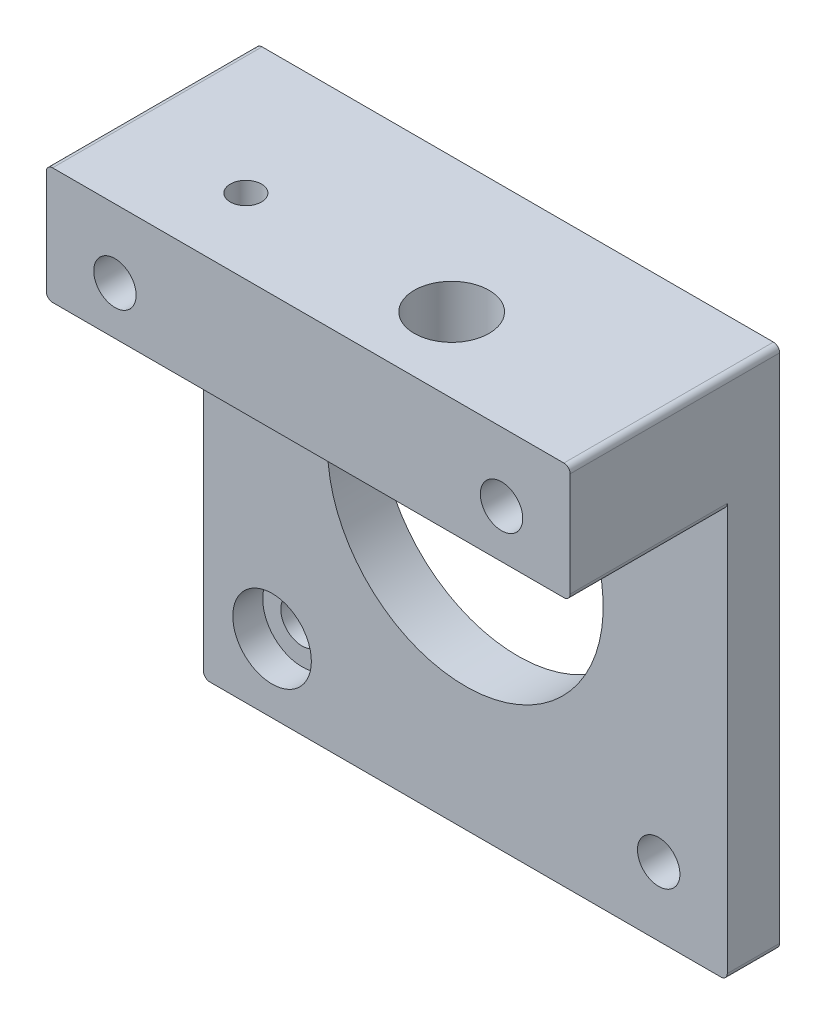
ISO-10303-21;
HEADER;
FILE_DESCRIPTION(('STEP AP214'),'2;1');
FILE_NAME('part.step','',(''),(''),'','','');
FILE_SCHEMA(('AUTOMOTIVE_DESIGN { 1 0 10303 214 1 1 1 1 }'));
ENDSEC;
DATA;
#1=APPLICATION_CONTEXT('core data for automotive mechanical design processes');
#2=APPLICATION_PROTOCOL_DEFINITION('international standard','automotive_design',2000,#1);
#3=PRODUCT_CONTEXT('',#1,'mechanical');
#4=PRODUCT('Part','Part','',(#3));
#5=PRODUCT_RELATED_PRODUCT_CATEGORY('part','',(#4));
#6=PRODUCT_DEFINITION_FORMATION('','',#4);
#7=PRODUCT_DEFINITION_CONTEXT('part definition',#1,'design');
#8=PRODUCT_DEFINITION('design','',#6,#7);
#9=PRODUCT_DEFINITION_SHAPE('','',#8);
#10=(LENGTH_UNIT() NAMED_UNIT(*) SI_UNIT(.MILLI.,.METRE.));
#11=(NAMED_UNIT(*) PLANE_ANGLE_UNIT() SI_UNIT($,.RADIAN.));
#12=(NAMED_UNIT(*) SI_UNIT($,.STERADIAN.) SOLID_ANGLE_UNIT());
#13=UNCERTAINTY_MEASURE_WITH_UNIT(LENGTH_MEASURE(1.E-05),#10,'distance_accuracy_value','');
#14=(GEOMETRIC_REPRESENTATION_CONTEXT(3) GLOBAL_UNCERTAINTY_ASSIGNED_CONTEXT((#13)) GLOBAL_UNIT_ASSIGNED_CONTEXT((#10,
#11,#12)) REPRESENTATION_CONTEXT('',''));
#15=CARTESIAN_POINT('',(0.,0.,0.));
#16=DIRECTION('',(0.,0.,1.));
#17=DIRECTION('',(1.,0.,0.));
#18=AXIS2_PLACEMENT_3D('',#15,#16,#17);
#19=CARTESIAN_POINT('',(-15.5,-15.5,16.8));
#20=DIRECTION('',(0.,0.,1.));
#21=DIRECTION('',(1.,0.,0.));
#22=AXIS2_PLACEMENT_3D('',#19,#20,#21);
#23=CYLINDRICAL_SURFACE('',#22,1.7);
#24=CARTESIAN_POINT('',(-15.5,-15.5,0.));
#25=DIRECTION('',(0.,0.,1.));
#26=DIRECTION('',(1.,0.,0.));
#27=AXIS2_PLACEMENT_3D('',#24,#25,#26);
#28=CIRCLE('',#27,1.7);
#29=CARTESIAN_POINT('',(-13.8,-15.5,0.));
#30=VERTEX_POINT('',#29);
#31=EDGE_CURVE('E328',#30,#30,#28,.T.);
#32=ORIENTED_EDGE('',*,*,#31,.F.);
#33=EDGE_LOOP('',(#32));
#34=FACE_BOUND('',#33,.T.);
#35=CARTESIAN_POINT('',(-15.5,-15.5,1.8));
#36=DIRECTION('',(0.,0.,1.));
#37=DIRECTION('',(1.,0.,0.));
#38=AXIS2_PLACEMENT_3D('',#35,#36,#37);
#39=CIRCLE('',#38,1.7);
#40=CARTESIAN_POINT('',(-13.8,-15.5,1.8));
#41=VERTEX_POINT('',#40);
#42=EDGE_CURVE('E300',#41,#41,#39,.F.);
#43=ORIENTED_EDGE('',*,*,#42,.F.);
#44=EDGE_LOOP('',(#43));
#45=FACE_BOUND('',#44,.T.);
#46=ADVANCED_FACE('F37',(#34,#45),#23,.F.);
#47=CARTESIAN_POINT('',(21.,21.,16.8));
#48=DIRECTION('',(-1.,0.,0.));
#49=DIRECTION('',(0.,-1.,0.));
#50=AXIS2_PLACEMENT_3D('',#47,#48,#49);
#51=PLANE('',#50);
#52=DIRECTION('',(0.,1.,0.));
#53=VECTOR('',#52,1.);
#54=CARTESIAN_POINT('',(21.,-21.,4.2));
#55=LINE('',#54,#53);
#56=CARTESIAN_POINT('',(21.,-20.5,4.2));
#57=VERTEX_POINT('',#56);
#58=CARTESIAN_POINT('',(21.,12.15,4.2));
#59=VERTEX_POINT('',#58);
#60=EDGE_CURVE('E150',#57,#59,#55,.T.);
#61=ORIENTED_EDGE('',*,*,#60,.F.);
#62=DIRECTION('',(0.,0.,-1.));
#63=VECTOR('',#62,1.);
#64=CARTESIAN_POINT('',(21.,-20.5,16.8));
#65=LINE('',#64,#63);
#66=CARTESIAN_POINT('',(21.,-20.5,0.));
#67=VERTEX_POINT('',#66);
#68=EDGE_CURVE('E179',#57,#67,#65,.T.);
#69=ORIENTED_EDGE('',*,*,#68,.T.);
#70=DIRECTION('',(0.,1.,0.));
#71=VECTOR('',#70,1.);
#72=CARTESIAN_POINT('',(21.,21.,0.));
#73=LINE('',#72,#71);
#74=CARTESIAN_POINT('',(21.,20.5,0.));
#75=VERTEX_POINT('',#74);
#76=EDGE_CURVE('E206',#67,#75,#73,.T.);
#77=ORIENTED_EDGE('',*,*,#76,.T.);
#78=DIRECTION('',(0.,0.,-1.));
#79=VECTOR('',#78,1.);
#80=CARTESIAN_POINT('',(21.,20.5,16.8));
#81=LINE('',#80,#79);
#82=CARTESIAN_POINT('',(21.,20.5,16.8));
#83=VERTEX_POINT('',#82);
#84=EDGE_CURVE('E177',#75,#83,#81,.F.);
#85=ORIENTED_EDGE('',*,*,#84,.T.);
#86=DIRECTION('',(0.,1.,0.));
#87=VECTOR('',#86,1.);
#88=CARTESIAN_POINT('',(21.,21.,16.8));
#89=LINE('',#88,#87);
#90=CARTESIAN_POINT('',(21.,12.15,16.8));
#91=VERTEX_POINT('',#90);
#92=EDGE_CURVE('E285',#91,#83,#89,.T.);
#93=ORIENTED_EDGE('',*,*,#92,.F.);
#94=DIRECTION('',(0.,0.,1.));
#95=VECTOR('',#94,1.);
#96=CARTESIAN_POINT('',(21.,12.15,16.8));
#97=LINE('',#96,#95);
#98=EDGE_CURVE('E139',#91,#59,#97,.F.);
#99=ORIENTED_EDGE('',*,*,#98,.T.);
#100=EDGE_LOOP('',(#61,#69,#77,#85,#93,#99));
#101=FACE_BOUND('',#100,.T.);
#102=ADVANCED_FACE('F222',(#101),#51,.F.);
#103=CARTESIAN_POINT('',(-21.,21.,16.8));
#104=DIRECTION('',(0.,-1.,0.));
#105=DIRECTION('',(0.,0.,-1.));
#106=AXIS2_PLACEMENT_3D('',#103,#104,#105);
#107=PLANE('',#106);
#108=CARTESIAN_POINT('',(5.49999999999998,21.,10.8));
#109=DIRECTION('',(0.,1.,0.));
#110=DIRECTION('',(0.,0.,1.));
#111=AXIS2_PLACEMENT_3D('',#108,#109,#110);
#112=CIRCLE('',#111,3.);
#113=CARTESIAN_POINT('',(5.49999999999998,21.,13.8));
#114=VERTEX_POINT('',#113);
#115=EDGE_CURVE('E540',#114,#114,#112,.T.);
#116=ORIENTED_EDGE('',*,*,#115,.F.);
#117=EDGE_LOOP('',(#116));
#118=FACE_BOUND('',#117,.T.);
#119=CARTESIAN_POINT('',(-11.,21.,10.8));
#120=DIRECTION('',(0.,1.,0.));
#121=DIRECTION('',(0.,0.,1.));
#122=AXIS2_PLACEMENT_3D('',#119,#120,#121);
#123=CIRCLE('',#122,1.25);
#124=CARTESIAN_POINT('',(-11.,21.,12.05));
#125=VERTEX_POINT('',#124);
#126=EDGE_CURVE('E537',#125,#125,#123,.T.);
#127=ORIENTED_EDGE('',*,*,#126,.F.);
#128=EDGE_LOOP('',(#127));
#129=FACE_BOUND('',#128,.T.);
#130=DIRECTION('',(-1.,0.,0.));
#131=VECTOR('',#130,1.);
#132=CARTESIAN_POINT('',(-21.,21.,16.8));
#133=LINE('',#132,#131);
#134=CARTESIAN_POINT('',(20.5,21.,16.8));
#135=VERTEX_POINT('',#134);
#136=CARTESIAN_POINT('',(-20.5,21.,16.8));
#137=VERTEX_POINT('',#136);
#138=EDGE_CURVE('E288',#135,#137,#133,.T.);
#139=ORIENTED_EDGE('',*,*,#138,.F.);
#140=DIRECTION('',(0.,0.,-1.));
#141=VECTOR('',#140,1.);
#142=CARTESIAN_POINT('',(20.5,21.,16.8));
#143=LINE('',#142,#141);
#144=CARTESIAN_POINT('',(20.5,21.,0.));
#145=VERTEX_POINT('',#144);
#146=EDGE_CURVE('E184',#135,#145,#143,.T.);
#147=ORIENTED_EDGE('',*,*,#146,.T.);
#148=DIRECTION('',(-1.,0.,0.));
#149=VECTOR('',#148,1.);
#150=CARTESIAN_POINT('',(-21.,21.,0.));
#151=LINE('',#150,#149);
#152=CARTESIAN_POINT('',(-20.5,21.,0.));
#153=VERTEX_POINT('',#152);
#154=EDGE_CURVE('E294',#145,#153,#151,.T.);
#155=ORIENTED_EDGE('',*,*,#154,.T.);
#156=DIRECTION('',(0.,0.,-1.));
#157=VECTOR('',#156,1.);
#158=CARTESIAN_POINT('',(-20.5,21.,16.8));
#159=LINE('',#158,#157);
#160=EDGE_CURVE('E182',#153,#137,#159,.F.);
#161=ORIENTED_EDGE('',*,*,#160,.T.);
#162=EDGE_LOOP('',(#139,#147,#155,#161));
#163=FACE_BOUND('',#162,.T.);
#164=ADVANCED_FACE('F228',(#118,#129,#163),#107,.F.);
#165=CARTESIAN_POINT('',(-21.,21.,16.8));
#166=DIRECTION('',(1.,0.,0.));
#167=DIRECTION('',(0.,0.,-1.));
#168=AXIS2_PLACEMENT_3D('',#165,#166,#167);
#169=PLANE('',#168);
#170=DIRECTION('',(0.,-1.,0.));
#171=VECTOR('',#170,1.);
#172=CARTESIAN_POINT('',(-21.,21.,0.));
#173=LINE('',#172,#171);
#174=CARTESIAN_POINT('',(-21.,20.5,0.));
#175=VERTEX_POINT('',#174);
#176=CARTESIAN_POINT('',(-21.,-20.5,0.));
#177=VERTEX_POINT('',#176);
#178=EDGE_CURVE('E297',#175,#177,#173,.T.);
#179=ORIENTED_EDGE('',*,*,#178,.T.);
#180=DIRECTION('',(0.,0.,-1.));
#181=VECTOR('',#180,1.);
#182=CARTESIAN_POINT('',(-21.,-20.5,16.8));
#183=LINE('',#182,#181);
#184=CARTESIAN_POINT('',(-21.,-20.5,4.2));
#185=VERTEX_POINT('',#184);
#186=EDGE_CURVE('E172',#177,#185,#183,.F.);
#187=ORIENTED_EDGE('',*,*,#186,.T.);
#188=DIRECTION('',(0.,-1.,0.));
#189=VECTOR('',#188,1.);
#190=CARTESIAN_POINT('',(-21.,-21.,4.2));
#191=LINE('',#190,#189);
#192=CARTESIAN_POINT('',(-21.,12.15,4.2));
#193=VERTEX_POINT('',#192);
#194=EDGE_CURVE('E135',#193,#185,#191,.T.);
#195=ORIENTED_EDGE('',*,*,#194,.F.);
#196=DIRECTION('',(0.,0.,1.));
#197=VECTOR('',#196,1.);
#198=CARTESIAN_POINT('',(-21.,12.15,16.8));
#199=LINE('',#198,#197);
#200=CARTESIAN_POINT('',(-21.,12.15,16.8));
#201=VERTEX_POINT('',#200);
#202=EDGE_CURVE('E169',#193,#201,#199,.T.);
#203=ORIENTED_EDGE('',*,*,#202,.T.);
#204=DIRECTION('',(0.,-1.,0.));
#205=VECTOR('',#204,1.);
#206=CARTESIAN_POINT('',(-21.,21.,16.8));
#207=LINE('',#206,#205);
#208=CARTESIAN_POINT('',(-21.,20.5,16.8));
#209=VERTEX_POINT('',#208);
#210=EDGE_CURVE('E158',#209,#201,#207,.T.);
#211=ORIENTED_EDGE('',*,*,#210,.F.);
#212=DIRECTION('',(0.,0.,-1.));
#213=VECTOR('',#212,1.);
#214=CARTESIAN_POINT('',(-21.,20.5,16.8));
#215=LINE('',#214,#213);
#216=EDGE_CURVE('E166',#209,#175,#215,.T.);
#217=ORIENTED_EDGE('',*,*,#216,.T.);
#218=EDGE_LOOP('',(#179,#187,#195,#203,#211,#217));
#219=FACE_BOUND('',#218,.T.);
#220=ADVANCED_FACE('F261',(#219),#169,.F.);
#221=CARTESIAN_POINT('',(-21.,-21.,16.8));
#222=DIRECTION('',(0.,1.,0.));
#223=DIRECTION('',(0.,0.,1.));
#224=AXIS2_PLACEMENT_3D('',#221,#222,#223);
#225=PLANE('',#224);
#226=DIRECTION('',(1.,0.,0.));
#227=VECTOR('',#226,1.);
#228=CARTESIAN_POINT('',(-21.,-21.,4.2));
#229=LINE('',#228,#227);
#230=CARTESIAN_POINT('',(-20.5,-21.,4.2));
#231=VERTEX_POINT('',#230);
#232=CARTESIAN_POINT('',(20.5,-21.,4.2));
#233=VERTEX_POINT('',#232);
#234=EDGE_CURVE('E133',#231,#233,#229,.T.);
#235=ORIENTED_EDGE('',*,*,#234,.F.);
#236=DIRECTION('',(0.,0.,-1.));
#237=VECTOR('',#236,1.);
#238=CARTESIAN_POINT('',(-20.5,-21.,16.8));
#239=LINE('',#238,#237);
#240=CARTESIAN_POINT('',(-20.5,-21.,0.));
#241=VERTEX_POINT('',#240);
#242=EDGE_CURVE('E146',#231,#241,#239,.T.);
#243=ORIENTED_EDGE('',*,*,#242,.T.);
#244=DIRECTION('',(1.,0.,0.));
#245=VECTOR('',#244,1.);
#246=CARTESIAN_POINT('',(-21.,-21.,0.));
#247=LINE('',#246,#245);
#248=CARTESIAN_POINT('',(20.5,-21.,0.));
#249=VERTEX_POINT('',#248);
#250=EDGE_CURVE('E289',#241,#249,#247,.T.);
#251=ORIENTED_EDGE('',*,*,#250,.T.);
#252=DIRECTION('',(0.,0.,-1.));
#253=VECTOR('',#252,1.);
#254=CARTESIAN_POINT('',(20.5,-21.,16.8));
#255=LINE('',#254,#253);
#256=EDGE_CURVE('E149',#249,#233,#255,.F.);
#257=ORIENTED_EDGE('',*,*,#256,.T.);
#258=EDGE_LOOP('',(#235,#243,#251,#257));
#259=FACE_BOUND('',#258,.T.);
#260=ADVANCED_FACE('F144',(#259),#225,.F.);
#261=CARTESIAN_POINT('',(0.,0.,16.8));
#262=DIRECTION('',(0.,0.,1.));
#263=DIRECTION('',(1.,0.,0.));
#264=AXIS2_PLACEMENT_3D('',#261,#262,#263);
#265=PLANE('',#264);
#266=CARTESIAN_POINT('',(15.5,15.5,16.8));
#267=DIRECTION('',(0.,0.,1.));
#268=DIRECTION('',(1.,0.,0.));
#269=AXIS2_PLACEMENT_3D('',#266,#267,#268);
#270=CIRCLE('',#269,1.7);
#271=CARTESIAN_POINT('',(17.2,15.5,16.8));
#272=VERTEX_POINT('',#271);
#273=EDGE_CURVE('E302',#272,#272,#270,.T.);
#274=ORIENTED_EDGE('',*,*,#273,.F.);
#275=EDGE_LOOP('',(#274));
#276=FACE_BOUND('',#275,.T.);
#277=CARTESIAN_POINT('',(-15.5,15.5,16.8));
#278=DIRECTION('',(0.,0.,1.));
#279=DIRECTION('',(1.,0.,0.));
#280=AXIS2_PLACEMENT_3D('',#277,#278,#279);
#281=CIRCLE('',#280,1.7);
#282=CARTESIAN_POINT('',(-13.8,15.5,16.8));
#283=VERTEX_POINT('',#282);
#284=EDGE_CURVE('E322',#283,#283,#281,.T.);
#285=ORIENTED_EDGE('',*,*,#284,.F.);
#286=EDGE_LOOP('',(#285));
#287=FACE_BOUND('',#286,.T.);
#288=ORIENTED_EDGE('',*,*,#92,.T.);
#289=CARTESIAN_POINT('',(20.5,20.5,16.8));
#290=DIRECTION('',(0.,0.,1.));
#291=DIRECTION('',(1.,0.,0.));
#292=AXIS2_PLACEMENT_3D('',#289,#290,#291);
#293=CIRCLE('',#292,0.5);
#294=EDGE_CURVE('E191',#83,#135,#293,.T.);
#295=ORIENTED_EDGE('',*,*,#294,.T.);
#296=ORIENTED_EDGE('',*,*,#138,.T.);
#297=CARTESIAN_POINT('',(-20.5,20.5,16.8));
#298=DIRECTION('',(0.,0.,1.));
#299=DIRECTION('',(1.,0.,0.));
#300=AXIS2_PLACEMENT_3D('',#297,#298,#299);
#301=CIRCLE('',#300,0.5);
#302=EDGE_CURVE('E187',#137,#209,#301,.T.);
#303=ORIENTED_EDGE('',*,*,#302,.T.);
#304=ORIENTED_EDGE('',*,*,#210,.T.);
#305=CARTESIAN_POINT('',(-20.5,12.15,16.8));
#306=DIRECTION('',(0.,0.,1.));
#307=DIRECTION('',(1.,0.,0.));
#308=AXIS2_PLACEMENT_3D('',#305,#306,#307);
#309=CIRCLE('',#308,0.5);
#310=CARTESIAN_POINT('',(-20.5,11.65,16.8));
#311=VERTEX_POINT('',#310);
#312=EDGE_CURVE('E53',#201,#311,#309,.T.);
#313=ORIENTED_EDGE('',*,*,#312,.T.);
#314=DIRECTION('',(-1.,0.,0.));
#315=VECTOR('',#314,1.);
#316=CARTESIAN_POINT('',(-21.,11.65,16.8));
#317=LINE('',#316,#315);
#318=CARTESIAN_POINT('',(20.5,11.65,16.8));
#319=VERTEX_POINT('',#318);
#320=EDGE_CURVE('E282',#319,#311,#317,.T.);
#321=ORIENTED_EDGE('',*,*,#320,.F.);
#322=CARTESIAN_POINT('',(20.5,12.15,16.8));
#323=DIRECTION('',(0.,0.,1.));
#324=DIRECTION('',(1.,0.,0.));
#325=AXIS2_PLACEMENT_3D('',#322,#323,#324);
#326=CIRCLE('',#325,0.5);
#327=EDGE_CURVE('E61',#319,#91,#326,.T.);
#328=ORIENTED_EDGE('',*,*,#327,.T.);
#329=EDGE_LOOP('',(#288,#295,#296,#303,#304,#313,#321,#328));
#330=FACE_BOUND('',#329,.T.);
#331=ADVANCED_FACE('F252',(#276,#287,#330),#265,.T.);
#332=CARTESIAN_POINT('',(0.,0.,0.));
#333=DIRECTION('',(0.,0.,1.));
#334=DIRECTION('',(1.,0.,0.));
#335=AXIS2_PLACEMENT_3D('',#332,#333,#334);
#336=PLANE('',#335);
#337=CARTESIAN_POINT('',(15.5,15.5,0.));
#338=DIRECTION('',(0.,0.,1.));
#339=DIRECTION('',(1.,0.,0.));
#340=AXIS2_PLACEMENT_3D('',#337,#338,#339);
#341=CIRCLE('',#340,1.7);
#342=CARTESIAN_POINT('',(17.2,15.5,0.));
#343=VERTEX_POINT('',#342);
#344=EDGE_CURVE('E307',#343,#343,#341,.T.);
#345=ORIENTED_EDGE('',*,*,#344,.T.);
#346=EDGE_LOOP('',(#345));
#347=FACE_BOUND('',#346,.T.);
#348=CARTESIAN_POINT('',(-15.5,15.5,0.));
#349=DIRECTION('',(0.,0.,1.));
#350=DIRECTION('',(1.,0.,0.));
#351=AXIS2_PLACEMENT_3D('',#348,#349,#350);
#352=CIRCLE('',#351,1.7);
#353=CARTESIAN_POINT('',(-13.8,15.5,0.));
#354=VERTEX_POINT('',#353);
#355=EDGE_CURVE('E325',#354,#354,#352,.T.);
#356=ORIENTED_EDGE('',*,*,#355,.T.);
#357=EDGE_LOOP('',(#356));
#358=FACE_BOUND('',#357,.T.);
#359=ORIENTED_EDGE('',*,*,#31,.T.);
#360=EDGE_LOOP('',(#359));
#361=FACE_BOUND('',#360,.T.);
#362=CARTESIAN_POINT('',(15.5,-15.5,0.));
#363=DIRECTION('',(0.,0.,1.));
#364=DIRECTION('',(1.,0.,0.));
#365=AXIS2_PLACEMENT_3D('',#362,#363,#364);
#366=CIRCLE('',#365,1.7);
#367=CARTESIAN_POINT('',(17.2,-15.5,0.));
#368=VERTEX_POINT('',#367);
#369=EDGE_CURVE('E331',#368,#368,#366,.T.);
#370=ORIENTED_EDGE('',*,*,#369,.T.);
#371=EDGE_LOOP('',(#370));
#372=FACE_BOUND('',#371,.T.);
#373=CARTESIAN_POINT('',(0.,0.,0.));
#374=DIRECTION('',(0.,0.,-1.));
#375=DIRECTION('',(-1.,0.,0.));
#376=AXIS2_PLACEMENT_3D('',#373,#374,#375);
#377=CIRCLE('',#376,11.05);
#378=CARTESIAN_POINT('',(-11.05,0.,0.));
#379=VERTEX_POINT('',#378);
#380=EDGE_CURVE('E337',#379,#379,#377,.T.);
#381=ORIENTED_EDGE('',*,*,#380,.F.);
#382=EDGE_LOOP('',(#381));
#383=FACE_BOUND('',#382,.T.);
#384=ORIENTED_EDGE('',*,*,#250,.F.);
#385=CARTESIAN_POINT('',(-20.5,-20.5,0.));
#386=DIRECTION('',(0.,0.,1.));
#387=DIRECTION('',(1.,0.,0.));
#388=AXIS2_PLACEMENT_3D('',#385,#386,#387);
#389=CIRCLE('',#388,0.5);
#390=EDGE_CURVE('E153',#241,#177,#389,.F.);
#391=ORIENTED_EDGE('',*,*,#390,.T.);
#392=ORIENTED_EDGE('',*,*,#178,.F.);
#393=CARTESIAN_POINT('',(-20.5,20.5,0.));
#394=DIRECTION('',(0.,0.,1.));
#395=DIRECTION('',(1.,0.,0.));
#396=AXIS2_PLACEMENT_3D('',#393,#394,#395);
#397=CIRCLE('',#396,0.5);
#398=EDGE_CURVE('E154',#175,#153,#397,.F.);
#399=ORIENTED_EDGE('',*,*,#398,.T.);
#400=ORIENTED_EDGE('',*,*,#154,.F.);
#401=CARTESIAN_POINT('',(20.5,20.5,0.));
#402=DIRECTION('',(0.,0.,1.));
#403=DIRECTION('',(1.,0.,0.));
#404=AXIS2_PLACEMENT_3D('',#401,#402,#403);
#405=CIRCLE('',#404,0.5);
#406=EDGE_CURVE('E156',#145,#75,#405,.F.);
#407=ORIENTED_EDGE('',*,*,#406,.T.);
#408=ORIENTED_EDGE('',*,*,#76,.F.);
#409=CARTESIAN_POINT('',(20.5,-20.5,0.));
#410=DIRECTION('',(0.,0.,1.));
#411=DIRECTION('',(1.,0.,0.));
#412=AXIS2_PLACEMENT_3D('',#409,#410,#411);
#413=CIRCLE('',#412,0.5);
#414=EDGE_CURVE('E163',#67,#249,#413,.F.);
#415=ORIENTED_EDGE('',*,*,#414,.T.);
#416=EDGE_LOOP('',(#384,#391,#392,#399,#400,#407,#408,#415));
#417=FACE_BOUND('',#416,.T.);
#418=ADVANCED_FACE('F250',(#347,#358,#361,#372,#383,#417),#336,.F.);
#419=CARTESIAN_POINT('',(-21.,11.65,4.2));
#420=DIRECTION('',(0.,1.,0.));
#421=DIRECTION('',(0.,0.,1.));
#422=AXIS2_PLACEMENT_3D('',#419,#420,#421);
#423=PLANE('',#422);
#424=CARTESIAN_POINT('',(5.49999999999998,11.65,10.8));
#425=DIRECTION('',(0.,1.,0.));
#426=DIRECTION('',(0.,0.,1.));
#427=AXIS2_PLACEMENT_3D('',#424,#425,#426);
#428=CIRCLE('',#427,3.);
#429=CARTESIAN_POINT('',(5.49999999999998,11.65,13.8));
#430=VERTEX_POINT('',#429);
#431=EDGE_CURVE('E41',#430,#430,#428,.T.);
#432=ORIENTED_EDGE('',*,*,#431,.T.);
#433=EDGE_LOOP('',(#432));
#434=FACE_BOUND('',#433,.T.);
#435=CARTESIAN_POINT('',(-11.,11.65,10.8));
#436=DIRECTION('',(0.,1.,0.));
#437=DIRECTION('',(0.,0.,1.));
#438=AXIS2_PLACEMENT_3D('',#435,#436,#437);
#439=CIRCLE('',#438,1.25);
#440=CARTESIAN_POINT('',(-11.,11.65,12.05));
#441=VERTEX_POINT('',#440);
#442=EDGE_CURVE('E315',#441,#441,#439,.T.);
#443=ORIENTED_EDGE('',*,*,#442,.T.);
#444=EDGE_LOOP('',(#443));
#445=FACE_BOUND('',#444,.T.);
#446=DIRECTION('',(-1.,0.,0.));
#447=VECTOR('',#446,1.);
#448=CARTESIAN_POINT('',(-21.,11.65,4.2));
#449=LINE('',#448,#447);
#450=CARTESIAN_POINT('',(20.5,11.65,4.2));
#451=VERTEX_POINT('',#450);
#452=CARTESIAN_POINT('',(-20.5,11.65,4.2));
#453=VERTEX_POINT('',#452);
#454=EDGE_CURVE('E200',#451,#453,#449,.T.);
#455=ORIENTED_EDGE('',*,*,#454,.F.);
#456=DIRECTION('',(0.,0.,1.));
#457=VECTOR('',#456,1.);
#458=CARTESIAN_POINT('',(20.5,11.65,4.2));
#459=LINE('',#458,#457);
#460=EDGE_CURVE('E195',#451,#319,#459,.T.);
#461=ORIENTED_EDGE('',*,*,#460,.T.);
#462=ORIENTED_EDGE('',*,*,#320,.T.);
#463=DIRECTION('',(0.,0.,1.));
#464=VECTOR('',#463,1.);
#465=CARTESIAN_POINT('',(-20.5,11.65,4.2));
#466=LINE('',#465,#464);
#467=EDGE_CURVE('E193',#311,#453,#466,.F.);
#468=ORIENTED_EDGE('',*,*,#467,.T.);
#469=EDGE_LOOP('',(#455,#461,#462,#468));
#470=FACE_BOUND('',#469,.T.);
#471=ADVANCED_FACE('F204',(#434,#445,#470),#423,.F.);
#472=CARTESIAN_POINT('',(0.,0.,4.2));
#473=DIRECTION('',(0.,0.,-1.));
#474=DIRECTION('',(-1.,0.,0.));
#475=AXIS2_PLACEMENT_3D('',#472,#473,#474);
#476=PLANE('',#475);
#477=CARTESIAN_POINT('',(-15.5,-15.5,4.2));
#478=DIRECTION('',(0.,0.,1.));
#479=DIRECTION('',(1.,0.,0.));
#480=AXIS2_PLACEMENT_3D('',#477,#478,#479);
#481=CIRCLE('',#480,3.15);
#482=CARTESIAN_POINT('',(-12.35,-15.5,4.2));
#483=VERTEX_POINT('',#482);
#484=EDGE_CURVE('E310',#483,#483,#481,.T.);
#485=ORIENTED_EDGE('',*,*,#484,.F.);
#486=EDGE_LOOP('',(#485));
#487=FACE_BOUND('',#486,.T.);
#488=CARTESIAN_POINT('',(15.5,-15.5,4.2));
#489=DIRECTION('',(0.,0.,-1.));
#490=DIRECTION('',(-1.,0.,0.));
#491=AXIS2_PLACEMENT_3D('',#488,#489,#490);
#492=CIRCLE('',#491,1.7);
#493=CARTESIAN_POINT('',(13.8,-15.5,4.2));
#494=VERTEX_POINT('',#493);
#495=EDGE_CURVE('E334',#494,#494,#492,.T.);
#496=ORIENTED_EDGE('',*,*,#495,.T.);
#497=EDGE_LOOP('',(#496));
#498=FACE_BOUND('',#497,.T.);
#499=CARTESIAN_POINT('',(0.,0.,4.2));
#500=DIRECTION('',(0.,0.,-1.));
#501=DIRECTION('',(-1.,0.,0.));
#502=AXIS2_PLACEMENT_3D('',#499,#500,#501);
#503=CIRCLE('',#502,11.05);
#504=CARTESIAN_POINT('',(-11.05,0.,4.2));
#505=VERTEX_POINT('',#504);
#506=EDGE_CURVE('E284',#505,#505,#503,.F.);
#507=ORIENTED_EDGE('',*,*,#506,.F.);
#508=EDGE_LOOP('',(#507));
#509=FACE_BOUND('',#508,.T.);
#510=ORIENTED_EDGE('',*,*,#194,.T.);
#511=CARTESIAN_POINT('',(-20.5,-20.5,4.2));
#512=DIRECTION('',(0.,0.,-1.));
#513=DIRECTION('',(-1.,0.,0.));
#514=AXIS2_PLACEMENT_3D('',#511,#512,#513);
#515=CIRCLE('',#514,0.5);
#516=EDGE_CURVE('E130',#185,#231,#515,.F.);
#517=ORIENTED_EDGE('',*,*,#516,.T.);
#518=ORIENTED_EDGE('',*,*,#234,.T.);
#519=CARTESIAN_POINT('',(20.5,-20.5,4.2));
#520=DIRECTION('',(0.,0.,-1.));
#521=DIRECTION('',(-1.,0.,0.));
#522=AXIS2_PLACEMENT_3D('',#519,#520,#521);
#523=CIRCLE('',#522,0.5);
#524=EDGE_CURVE('E140',#233,#57,#523,.F.);
#525=ORIENTED_EDGE('',*,*,#524,.T.);
#526=ORIENTED_EDGE('',*,*,#60,.T.);
#527=CARTESIAN_POINT('',(20.5,12.15,4.2));
#528=DIRECTION('',(0.,0.,-1.));
#529=DIRECTION('',(-1.,0.,0.));
#530=AXIS2_PLACEMENT_3D('',#527,#528,#529);
#531=CIRCLE('',#530,0.5);
#532=EDGE_CURVE('E46',#59,#451,#531,.T.);
#533=ORIENTED_EDGE('',*,*,#532,.T.);
#534=ORIENTED_EDGE('',*,*,#454,.T.);
#535=CARTESIAN_POINT('',(-20.5,12.15,4.2));
#536=DIRECTION('',(0.,0.,-1.));
#537=DIRECTION('',(-1.,0.,0.));
#538=AXIS2_PLACEMENT_3D('',#535,#536,#537);
#539=CIRCLE('',#538,0.5);
#540=EDGE_CURVE('E11',#453,#193,#539,.T.);
#541=ORIENTED_EDGE('',*,*,#540,.T.);
#542=EDGE_LOOP('',(#510,#517,#518,#525,#526,#533,#534,#541));
#543=FACE_BOUND('',#542,.T.);
#544=ADVANCED_FACE('F132',(#487,#498,#509,#543),#476,.F.);
#545=CARTESIAN_POINT('',(0.,0.,16.801));
#546=DIRECTION('',(0.,0.,-1.));
#547=DIRECTION('',(-1.,0.,0.));
#548=AXIS2_PLACEMENT_3D('',#545,#546,#547);
#549=CYLINDRICAL_SURFACE('',#548,11.05);
#550=ORIENTED_EDGE('',*,*,#380,.T.);
#551=EDGE_LOOP('',(#550));
#552=FACE_BOUND('',#551,.T.);
#553=ORIENTED_EDGE('',*,*,#506,.T.);
#554=EDGE_LOOP('',(#553));
#555=FACE_BOUND('',#554,.T.);
#556=ADVANCED_FACE('F240',(#552,#555),#549,.F.);
#557=CARTESIAN_POINT('',(15.5,-15.5,16.8));
#558=DIRECTION('',(0.,0.,1.));
#559=DIRECTION('',(1.,0.,0.));
#560=AXIS2_PLACEMENT_3D('',#557,#558,#559);
#561=CYLINDRICAL_SURFACE('',#560,1.7);
#562=ORIENTED_EDGE('',*,*,#369,.F.);
#563=EDGE_LOOP('',(#562));
#564=FACE_BOUND('',#563,.T.);
#565=ORIENTED_EDGE('',*,*,#495,.F.);
#566=EDGE_LOOP('',(#565));
#567=FACE_BOUND('',#566,.T.);
#568=ADVANCED_FACE('F237',(#564,#567),#561,.F.);
#569=CARTESIAN_POINT('',(-15.5,15.5,16.8));
#570=DIRECTION('',(0.,0.,1.));
#571=DIRECTION('',(1.,0.,0.));
#572=AXIS2_PLACEMENT_3D('',#569,#570,#571);
#573=CYLINDRICAL_SURFACE('',#572,1.7);
#574=ORIENTED_EDGE('',*,*,#355,.F.);
#575=EDGE_LOOP('',(#574));
#576=FACE_BOUND('',#575,.T.);
#577=ORIENTED_EDGE('',*,*,#284,.T.);
#578=EDGE_LOOP('',(#577));
#579=FACE_BOUND('',#578,.T.);
#580=ADVANCED_FACE('F235',(#576,#579),#573,.F.);
#581=CARTESIAN_POINT('',(15.5,15.5,16.8));
#582=DIRECTION('',(0.,0.,1.));
#583=DIRECTION('',(1.,0.,0.));
#584=AXIS2_PLACEMENT_3D('',#581,#582,#583);
#585=CYLINDRICAL_SURFACE('',#584,1.7);
#586=ORIENTED_EDGE('',*,*,#344,.F.);
#587=EDGE_LOOP('',(#586));
#588=FACE_BOUND('',#587,.T.);
#589=ORIENTED_EDGE('',*,*,#273,.T.);
#590=EDGE_LOOP('',(#589));
#591=FACE_BOUND('',#590,.T.);
#592=ADVANCED_FACE('F379',(#588,#591),#585,.F.);
#593=CARTESIAN_POINT('',(-15.5,-15.5,1.8));
#594=DIRECTION('',(0.,0.,1.));
#595=DIRECTION('',(1.,0.,0.));
#596=AXIS2_PLACEMENT_3D('',#593,#594,#595);
#597=PLANE('',#596);
#598=CARTESIAN_POINT('',(-15.5,-15.5,1.8));
#599=DIRECTION('',(0.,0.,1.));
#600=DIRECTION('',(1.,0.,0.));
#601=AXIS2_PLACEMENT_3D('',#598,#599,#600);
#602=CIRCLE('',#601,3.15);
#603=CARTESIAN_POINT('',(-12.35,-15.5,1.8));
#604=VERTEX_POINT('',#603);
#605=EDGE_CURVE('E303',#604,#604,#602,.T.);
#606=ORIENTED_EDGE('',*,*,#605,.T.);
#607=EDGE_LOOP('',(#606));
#608=FACE_BOUND('',#607,.T.);
#609=ORIENTED_EDGE('',*,*,#42,.T.);
#610=EDGE_LOOP('',(#609));
#611=FACE_BOUND('',#610,.T.);
#612=ADVANCED_FACE('F376',(#608,#611),#597,.T.);
#613=CARTESIAN_POINT('',(-15.5,-15.5,1.8));
#614=DIRECTION('',(0.,0.,1.));
#615=DIRECTION('',(1.,0.,0.));
#616=AXIS2_PLACEMENT_3D('',#613,#614,#615);
#617=CYLINDRICAL_SURFACE('',#616,3.15);
#618=ORIENTED_EDGE('',*,*,#605,.F.);
#619=EDGE_LOOP('',(#618));
#620=FACE_BOUND('',#619,.T.);
#621=ORIENTED_EDGE('',*,*,#484,.T.);
#622=EDGE_LOOP('',(#621));
#623=FACE_BOUND('',#622,.T.);
#624=ADVANCED_FACE('F374',(#620,#623),#617,.F.);
#625=CARTESIAN_POINT('',(-11.,21.,10.8));
#626=DIRECTION('',(0.,1.,0.));
#627=DIRECTION('',(0.,0.,1.));
#628=AXIS2_PLACEMENT_3D('',#625,#626,#627);
#629=CYLINDRICAL_SURFACE('',#628,1.25);
#630=ORIENTED_EDGE('',*,*,#442,.F.);
#631=EDGE_LOOP('',(#630));
#632=FACE_BOUND('',#631,.T.);
#633=ORIENTED_EDGE('',*,*,#126,.T.);
#634=EDGE_LOOP('',(#633));
#635=FACE_BOUND('',#634,.T.);
#636=ADVANCED_FACE('F270',(#632,#635),#629,.F.);
#637=CARTESIAN_POINT('',(-20.5,-20.5,16.8));
#638=DIRECTION('',(0.,0.,-1.));
#639=DIRECTION('',(-1.,0.,0.));
#640=AXIS2_PLACEMENT_3D('',#637,#638,#639);
#641=CYLINDRICAL_SURFACE('',#640,0.5);
#642=ORIENTED_EDGE('',*,*,#516,.F.);
#643=ORIENTED_EDGE('',*,*,#186,.F.);
#644=ORIENTED_EDGE('',*,*,#390,.F.);
#645=ORIENTED_EDGE('',*,*,#242,.F.);
#646=EDGE_LOOP('',(#642,#643,#644,#645));
#647=FACE_BOUND('',#646,.T.);
#648=ADVANCED_FACE('F152',(#647),#641,.T.);
#649=CARTESIAN_POINT('',(20.5,-20.5,16.8));
#650=DIRECTION('',(0.,0.,-1.));
#651=DIRECTION('',(-1.,0.,0.));
#652=AXIS2_PLACEMENT_3D('',#649,#650,#651);
#653=CYLINDRICAL_SURFACE('',#652,0.5);
#654=ORIENTED_EDGE('',*,*,#524,.F.);
#655=ORIENTED_EDGE('',*,*,#256,.F.);
#656=ORIENTED_EDGE('',*,*,#414,.F.);
#657=ORIENTED_EDGE('',*,*,#68,.F.);
#658=EDGE_LOOP('',(#654,#655,#656,#657));
#659=FACE_BOUND('',#658,.T.);
#660=ADVANCED_FACE('F218',(#659),#653,.T.);
#661=CARTESIAN_POINT('',(20.5,20.5,16.8));
#662=DIRECTION('',(0.,0.,-1.));
#663=DIRECTION('',(-1.,0.,0.));
#664=AXIS2_PLACEMENT_3D('',#661,#662,#663);
#665=CYLINDRICAL_SURFACE('',#664,0.5);
#666=ORIENTED_EDGE('',*,*,#294,.F.);
#667=ORIENTED_EDGE('',*,*,#84,.F.);
#668=ORIENTED_EDGE('',*,*,#406,.F.);
#669=ORIENTED_EDGE('',*,*,#146,.F.);
#670=EDGE_LOOP('',(#666,#667,#668,#669));
#671=FACE_BOUND('',#670,.T.);
#672=ADVANCED_FACE('F211',(#671),#665,.T.);
#673=CARTESIAN_POINT('',(20.5,12.15,4.2));
#674=DIRECTION('',(0.,0.,1.));
#675=DIRECTION('',(1.,0.,0.));
#676=AXIS2_PLACEMENT_3D('',#673,#674,#675);
#677=CYLINDRICAL_SURFACE('',#676,0.5);
#678=ORIENTED_EDGE('',*,*,#532,.F.);
#679=ORIENTED_EDGE('',*,*,#98,.F.);
#680=ORIENTED_EDGE('',*,*,#327,.F.);
#681=ORIENTED_EDGE('',*,*,#460,.F.);
#682=EDGE_LOOP('',(#678,#679,#680,#681));
#683=FACE_BOUND('',#682,.T.);
#684=ADVANCED_FACE('F208',(#683),#677,.T.);
#685=CARTESIAN_POINT('',(-20.5,12.15,16.8));
#686=DIRECTION('',(0.,0.,1.));
#687=DIRECTION('',(1.,0.,0.));
#688=AXIS2_PLACEMENT_3D('',#685,#686,#687);
#689=CYLINDRICAL_SURFACE('',#688,0.5);
#690=ORIENTED_EDGE('',*,*,#540,.F.);
#691=ORIENTED_EDGE('',*,*,#467,.F.);
#692=ORIENTED_EDGE('',*,*,#312,.F.);
#693=ORIENTED_EDGE('',*,*,#202,.F.);
#694=EDGE_LOOP('',(#690,#691,#692,#693));
#695=FACE_BOUND('',#694,.T.);
#696=ADVANCED_FACE('F210',(#695),#689,.T.);
#697=CARTESIAN_POINT('',(-20.5,20.5,16.8));
#698=DIRECTION('',(0.,0.,-1.));
#699=DIRECTION('',(-1.,0.,0.));
#700=AXIS2_PLACEMENT_3D('',#697,#698,#699);
#701=CYLINDRICAL_SURFACE('',#700,0.5);
#702=ORIENTED_EDGE('',*,*,#302,.F.);
#703=ORIENTED_EDGE('',*,*,#160,.F.);
#704=ORIENTED_EDGE('',*,*,#398,.F.);
#705=ORIENTED_EDGE('',*,*,#216,.F.);
#706=EDGE_LOOP('',(#702,#703,#704,#705));
#707=FACE_BOUND('',#706,.T.);
#708=ADVANCED_FACE('F39',(#707),#701,.T.);
#709=CARTESIAN_POINT('',(5.49999999999998,11.,10.8));
#710=DIRECTION('',(0.,1.,0.));
#711=DIRECTION('',(0.,0.,1.));
#712=AXIS2_PLACEMENT_3D('',#709,#710,#711);
#713=CYLINDRICAL_SURFACE('',#712,3.);
#714=ORIENTED_EDGE('',*,*,#115,.T.);
#715=EDGE_LOOP('',(#714));
#716=FACE_BOUND('',#715,.T.);
#717=ORIENTED_EDGE('',*,*,#431,.F.);
#718=EDGE_LOOP('',(#717));
#719=FACE_BOUND('',#718,.T.);
#720=ADVANCED_FACE('F361',(#716,#719),#713,.F.);
#721=CLOSED_SHELL('',(#46,#102,#164,#220,#260,#331,#418,#471,#544,#556,#568,#580,#592,#612,#624,
#636,#648,#660,#672,#684,#696,#708,#720));
#722=MANIFOLD_SOLID_BREP('B2',#721);
#723=ADVANCED_BREP_SHAPE_REPRESENTATION('',(#18,#722),#14);
#724=SHAPE_DEFINITION_REPRESENTATION(#9,#723);
ENDSEC;
END-ISO-10303-21;
